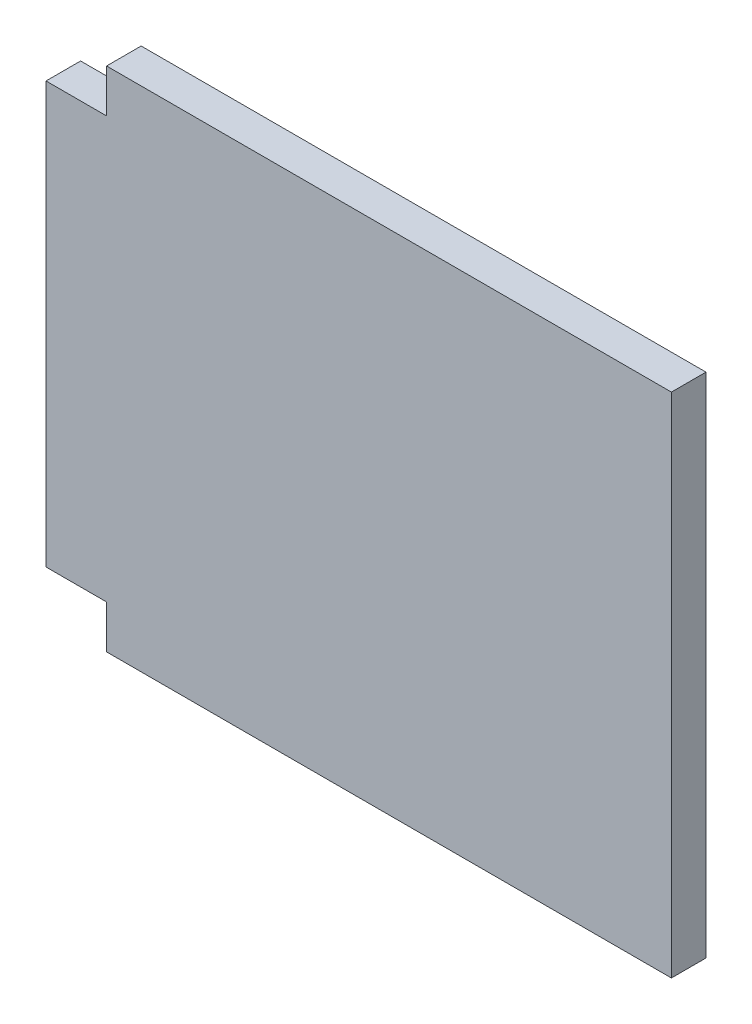
ISO-10303-21;
HEADER;
FILE_DESCRIPTION(('STEP AP214'),'2;1');
FILE_NAME('part.step','',(''),(''),'','','');
FILE_SCHEMA(('AUTOMOTIVE_DESIGN { 1 0 10303 214 1 1 1 1 }'));
ENDSEC;
DATA;
#1=APPLICATION_CONTEXT('core data for automotive mechanical design processes');
#2=APPLICATION_PROTOCOL_DEFINITION('international standard','automotive_design',2000,#1);
#3=PRODUCT_CONTEXT('',#1,'mechanical');
#4=PRODUCT('Part','Part','',(#3));
#5=PRODUCT_RELATED_PRODUCT_CATEGORY('part','',(#4));
#6=PRODUCT_DEFINITION_FORMATION('','',#4);
#7=PRODUCT_DEFINITION_CONTEXT('part definition',#1,'design');
#8=PRODUCT_DEFINITION('design','',#6,#7);
#9=PRODUCT_DEFINITION_SHAPE('','',#8);
#10=(LENGTH_UNIT() NAMED_UNIT(*) SI_UNIT(.MILLI.,.METRE.));
#11=(NAMED_UNIT(*) PLANE_ANGLE_UNIT() SI_UNIT($,.RADIAN.));
#12=(NAMED_UNIT(*) SI_UNIT($,.STERADIAN.) SOLID_ANGLE_UNIT());
#13=UNCERTAINTY_MEASURE_WITH_UNIT(LENGTH_MEASURE(1.E-05),#10,'distance_accuracy_value','');
#14=(GEOMETRIC_REPRESENTATION_CONTEXT(3) GLOBAL_UNCERTAINTY_ASSIGNED_CONTEXT((#13)) GLOBAL_UNIT_ASSIGNED_CONTEXT((#10,
#11,#12)) REPRESENTATION_CONTEXT('',''));
#15=CARTESIAN_POINT('',(0.,0.,0.));
#16=DIRECTION('',(0.,0.,1.));
#17=DIRECTION('',(1.,0.,0.));
#18=AXIS2_PLACEMENT_3D('',#15,#16,#17);
#19=CARTESIAN_POINT('',(-15.3915602948095,0.,2.));
#20=DIRECTION('',(1.,0.,0.));
#21=DIRECTION('',(0.,0.,-1.));
#22=AXIS2_PLACEMENT_3D('',#19,#20,#21);
#23=PLANE('',#22);
#24=DIRECTION('',(0.,-1.,0.));
#25=VECTOR('',#24,1.);
#26=CARTESIAN_POINT('',(-15.3915602948095,0.,0.));
#27=LINE('',#26,#25);
#28=CARTESIAN_POINT('',(-15.3915602948095,32.25,0.));
#29=VERTEX_POINT('',#28);
#30=CARTESIAN_POINT('',(-15.3915602948095,2.91,0.));
#31=VERTEX_POINT('',#30);
#32=EDGE_CURVE('E130',#29,#31,#27,.T.);
#33=ORIENTED_EDGE('',*,*,#32,.F.);
#34=DIRECTION('',(0.,0.,-1.));
#35=VECTOR('',#34,1.);
#36=CARTESIAN_POINT('',(-15.3915602948095,32.25,2.));
#37=LINE('',#36,#35);
#38=CARTESIAN_POINT('',(-15.3915602948095,32.25,2.));
#39=VERTEX_POINT('',#38);
#40=EDGE_CURVE('E11',#39,#29,#37,.T.);
#41=ORIENTED_EDGE('',*,*,#40,.F.);
#42=DIRECTION('',(0.,-1.,0.));
#43=VECTOR('',#42,1.);
#44=CARTESIAN_POINT('',(-15.3915602948095,0.,2.));
#45=LINE('',#44,#43);
#46=CARTESIAN_POINT('',(-15.3915602948095,2.91,2.));
#47=VERTEX_POINT('',#46);
#48=EDGE_CURVE('E148',#39,#47,#45,.T.);
#49=ORIENTED_EDGE('',*,*,#48,.T.);
#50=DIRECTION('',(0.,0.,-1.));
#51=VECTOR('',#50,1.);
#52=CARTESIAN_POINT('',(-15.3915602948095,2.91,2.));
#53=LINE('',#52,#51);
#54=EDGE_CURVE('E85',#47,#31,#53,.T.);
#55=ORIENTED_EDGE('',*,*,#54,.T.);
#56=EDGE_LOOP('',(#33,#41,#49,#55));
#57=FACE_BOUND('',#56,.T.);
#58=ADVANCED_FACE('F35',(#57),#23,.T.);
#59=CARTESIAN_POINT('',(0.,32.25,2.));
#60=DIRECTION('',(0.,1.,0.));
#61=DIRECTION('',(-1.,0.,0.));
#62=AXIS2_PLACEMENT_3D('',#59,#60,#61);
#63=PLANE('',#62);
#64=DIRECTION('',(1.,0.,0.));
#65=VECTOR('',#64,1.);
#66=CARTESIAN_POINT('',(0.,32.25,0.));
#67=LINE('',#66,#65);
#68=CARTESIAN_POINT('',(-48.0515602948095,32.25,0.));
#69=VERTEX_POINT('',#68);
#70=EDGE_CURVE('E133',#69,#29,#67,.T.);
#71=ORIENTED_EDGE('',*,*,#70,.F.);
#72=DIRECTION('',(0.,0.,-1.));
#73=VECTOR('',#72,1.);
#74=CARTESIAN_POINT('',(-48.0515602948095,32.25,2.));
#75=LINE('',#74,#73);
#76=CARTESIAN_POINT('',(-48.0515602948095,32.25,2.));
#77=VERTEX_POINT('',#76);
#78=EDGE_CURVE('E43',#77,#69,#75,.T.);
#79=ORIENTED_EDGE('',*,*,#78,.F.);
#80=DIRECTION('',(1.,0.,0.));
#81=VECTOR('',#80,1.);
#82=CARTESIAN_POINT('',(0.,32.25,2.));
#83=LINE('',#82,#81);
#84=EDGE_CURVE('E168',#77,#39,#83,.T.);
#85=ORIENTED_EDGE('',*,*,#84,.T.);
#86=ORIENTED_EDGE('',*,*,#40,.T.);
#87=EDGE_LOOP('',(#71,#79,#85,#86));
#88=FACE_BOUND('',#87,.T.);
#89=ADVANCED_FACE('F167',(#88),#63,.T.);
#90=CARTESIAN_POINT('',(-48.0515602948095,0.,2.));
#91=DIRECTION('',(1.,0.,0.));
#92=DIRECTION('',(0.,0.,-1.));
#93=AXIS2_PLACEMENT_3D('',#90,#91,#92);
#94=PLANE('',#93);
#95=DIRECTION('',(0.,-1.,0.));
#96=VECTOR('',#95,1.);
#97=CARTESIAN_POINT('',(-48.0515602948095,0.,0.));
#98=LINE('',#97,#96);
#99=CARTESIAN_POINT('',(-48.0515602948095,29.75,0.));
#100=VERTEX_POINT('',#99);
#101=EDGE_CURVE('E136',#69,#100,#98,.T.);
#102=ORIENTED_EDGE('',*,*,#101,.T.);
#103=DIRECTION('',(0.,0.,-1.));
#104=VECTOR('',#103,1.);
#105=CARTESIAN_POINT('',(-48.0515602948095,29.75,2.));
#106=LINE('',#105,#104);
#107=CARTESIAN_POINT('',(-48.0515602948095,29.75,2.));
#108=VERTEX_POINT('',#107);
#109=EDGE_CURVE('E154',#108,#100,#106,.T.);
#110=ORIENTED_EDGE('',*,*,#109,.F.);
#111=DIRECTION('',(0.,-1.,0.));
#112=VECTOR('',#111,1.);
#113=CARTESIAN_POINT('',(-48.0515602948095,0.,2.));
#114=LINE('',#113,#112);
#115=EDGE_CURVE('E118',#77,#108,#114,.T.);
#116=ORIENTED_EDGE('',*,*,#115,.F.);
#117=ORIENTED_EDGE('',*,*,#78,.T.);
#118=EDGE_LOOP('',(#102,#110,#116,#117));
#119=FACE_BOUND('',#118,.T.);
#120=ADVANCED_FACE('F158',(#119),#94,.F.);
#121=CARTESIAN_POINT('',(0.,29.75,2.));
#122=DIRECTION('',(0.,1.,0.));
#123=DIRECTION('',(0.,0.,1.));
#124=AXIS2_PLACEMENT_3D('',#121,#122,#123);
#125=PLANE('',#124);
#126=DIRECTION('',(1.,0.,0.));
#127=VECTOR('',#126,1.);
#128=CARTESIAN_POINT('',(0.,29.75,0.));
#129=LINE('',#128,#127);
#130=CARTESIAN_POINT('',(-51.5515602948095,29.75,0.));
#131=VERTEX_POINT('',#130);
#132=EDGE_CURVE('E139',#131,#100,#129,.T.);
#133=ORIENTED_EDGE('',*,*,#132,.F.);
#134=DIRECTION('',(0.,0.,-1.));
#135=VECTOR('',#134,1.);
#136=CARTESIAN_POINT('',(-51.5515602948095,29.75,2.));
#137=LINE('',#136,#135);
#138=CARTESIAN_POINT('',(-51.5515602948095,29.75,2.));
#139=VERTEX_POINT('',#138);
#140=EDGE_CURVE('E152',#139,#131,#137,.T.);
#141=ORIENTED_EDGE('',*,*,#140,.F.);
#142=DIRECTION('',(1.,0.,0.));
#143=VECTOR('',#142,1.);
#144=CARTESIAN_POINT('',(0.,29.75,2.));
#145=LINE('',#144,#143);
#146=EDGE_CURVE('E125',#139,#108,#145,.T.);
#147=ORIENTED_EDGE('',*,*,#146,.T.);
#148=ORIENTED_EDGE('',*,*,#109,.T.);
#149=EDGE_LOOP('',(#133,#141,#147,#148));
#150=FACE_BOUND('',#149,.T.);
#151=ADVANCED_FACE('F176',(#150),#125,.T.);
#152=CARTESIAN_POINT('',(-51.5515602948095,0.,2.));
#153=DIRECTION('',(-1.,0.,0.));
#154=DIRECTION('',(0.,0.,1.));
#155=AXIS2_PLACEMENT_3D('',#152,#153,#154);
#156=PLANE('',#155);
#157=DIRECTION('',(0.,1.,0.));
#158=VECTOR('',#157,1.);
#159=CARTESIAN_POINT('',(-51.5515602948095,0.,0.));
#160=LINE('',#159,#158);
#161=CARTESIAN_POINT('',(-51.5515602948095,5.41000000000001,0.));
#162=VERTEX_POINT('',#161);
#163=EDGE_CURVE('E142',#162,#131,#160,.T.);
#164=ORIENTED_EDGE('',*,*,#163,.F.);
#165=DIRECTION('',(0.,0.,-1.));
#166=VECTOR('',#165,1.);
#167=CARTESIAN_POINT('',(-51.5515602948095,5.41000000000001,2.));
#168=LINE('',#167,#166);
#169=CARTESIAN_POINT('',(-51.5515602948095,5.41000000000001,2.));
#170=VERTEX_POINT('',#169);
#171=EDGE_CURVE('E112',#170,#162,#168,.T.);
#172=ORIENTED_EDGE('',*,*,#171,.F.);
#173=DIRECTION('',(0.,1.,0.));
#174=VECTOR('',#173,1.);
#175=CARTESIAN_POINT('',(-51.5515602948095,0.,2.));
#176=LINE('',#175,#174);
#177=EDGE_CURVE('E123',#170,#139,#176,.T.);
#178=ORIENTED_EDGE('',*,*,#177,.T.);
#179=ORIENTED_EDGE('',*,*,#140,.T.);
#180=EDGE_LOOP('',(#164,#172,#178,#179));
#181=FACE_BOUND('',#180,.T.);
#182=ADVANCED_FACE('F179',(#181),#156,.T.);
#183=CARTESIAN_POINT('',(0.,5.41000000000001,2.));
#184=DIRECTION('',(0.,-1.,0.));
#185=DIRECTION('',(0.,0.,-1.));
#186=AXIS2_PLACEMENT_3D('',#183,#184,#185);
#187=PLANE('',#186);
#188=DIRECTION('',(-1.,0.,0.));
#189=VECTOR('',#188,1.);
#190=CARTESIAN_POINT('',(0.,5.41000000000001,0.));
#191=LINE('',#190,#189);
#192=CARTESIAN_POINT('',(-48.0515602948095,5.41000000000001,0.));
#193=VERTEX_POINT('',#192);
#194=EDGE_CURVE('E111',#193,#162,#191,.T.);
#195=ORIENTED_EDGE('',*,*,#194,.F.);
#196=DIRECTION('',(0.,0.,-1.));
#197=VECTOR('',#196,1.);
#198=CARTESIAN_POINT('',(-48.0515602948095,5.41000000000001,2.));
#199=LINE('',#198,#197);
#200=CARTESIAN_POINT('',(-48.0515602948095,5.41000000000001,2.));
#201=VERTEX_POINT('',#200);
#202=EDGE_CURVE('E105',#201,#193,#199,.T.);
#203=ORIENTED_EDGE('',*,*,#202,.F.);
#204=DIRECTION('',(-1.,0.,0.));
#205=VECTOR('',#204,1.);
#206=CARTESIAN_POINT('',(0.,5.41000000000001,2.));
#207=LINE('',#206,#205);
#208=EDGE_CURVE('E109',#201,#170,#207,.T.);
#209=ORIENTED_EDGE('',*,*,#208,.T.);
#210=ORIENTED_EDGE('',*,*,#171,.T.);
#211=EDGE_LOOP('',(#195,#203,#209,#210));
#212=FACE_BOUND('',#211,.T.);
#213=ADVANCED_FACE('F107',(#212),#187,.T.);
#214=CARTESIAN_POINT('',(-48.0515602948095,2.91000000000001,0.));
#215=VERTEX_POINT('',#214);
#216=EDGE_CURVE('E78',#193,#215,#98,.T.);
#217=ORIENTED_EDGE('',*,*,#216,.T.);
#218=DIRECTION('',(0.,0.,-1.));
#219=VECTOR('',#218,1.);
#220=CARTESIAN_POINT('',(-48.0515602948095,2.91000000000001,2.));
#221=LINE('',#220,#219);
#222=CARTESIAN_POINT('',(-48.0515602948095,2.91000000000001,2.));
#223=VERTEX_POINT('',#222);
#224=EDGE_CURVE('E113',#223,#215,#221,.T.);
#225=ORIENTED_EDGE('',*,*,#224,.F.);
#226=EDGE_CURVE('E115',#201,#223,#114,.T.);
#227=ORIENTED_EDGE('',*,*,#226,.F.);
#228=ORIENTED_EDGE('',*,*,#202,.T.);
#229=EDGE_LOOP('',(#217,#225,#227,#228));
#230=FACE_BOUND('',#229,.T.);
#231=ADVANCED_FACE('F116',(#230),#94,.F.);
#232=CARTESIAN_POINT('',(0.,2.91,2.));
#233=DIRECTION('',(0.,1.,0.));
#234=DIRECTION('',(-1.,0.,0.));
#235=AXIS2_PLACEMENT_3D('',#232,#233,#234);
#236=PLANE('',#235);
#237=DIRECTION('',(1.,0.,0.));
#238=VECTOR('',#237,1.);
#239=CARTESIAN_POINT('',(0.,2.91,0.));
#240=LINE('',#239,#238);
#241=EDGE_CURVE('E146',#215,#31,#240,.T.);
#242=ORIENTED_EDGE('',*,*,#241,.T.);
#243=ORIENTED_EDGE('',*,*,#54,.F.);
#244=DIRECTION('',(1.,0.,0.));
#245=VECTOR('',#244,1.);
#246=CARTESIAN_POINT('',(0.,2.91,2.));
#247=LINE('',#246,#245);
#248=EDGE_CURVE('E51',#223,#47,#247,.T.);
#249=ORIENTED_EDGE('',*,*,#248,.F.);
#250=ORIENTED_EDGE('',*,*,#224,.T.);
#251=EDGE_LOOP('',(#242,#243,#249,#250));
#252=FACE_BOUND('',#251,.T.);
#253=ADVANCED_FACE('F171',(#252),#236,.F.);
#254=CARTESIAN_POINT('',(0.,0.,2.));
#255=DIRECTION('',(0.,0.,1.));
#256=DIRECTION('',(1.,0.,0.));
#257=AXIS2_PLACEMENT_3D('',#254,#255,#256);
#258=PLANE('',#257);
#259=ORIENTED_EDGE('',*,*,#48,.F.);
#260=ORIENTED_EDGE('',*,*,#84,.F.);
#261=ORIENTED_EDGE('',*,*,#115,.T.);
#262=ORIENTED_EDGE('',*,*,#146,.F.);
#263=ORIENTED_EDGE('',*,*,#177,.F.);
#264=ORIENTED_EDGE('',*,*,#208,.F.);
#265=ORIENTED_EDGE('',*,*,#226,.T.);
#266=ORIENTED_EDGE('',*,*,#248,.T.);
#267=EDGE_LOOP('',(#259,#260,#261,#262,#263,#264,#265,#266));
#268=FACE_BOUND('',#267,.T.);
#269=ADVANCED_FACE('F120',(#268),#258,.T.);
#270=CARTESIAN_POINT('',(0.,0.,0.));
#271=DIRECTION('',(0.,0.,1.));
#272=DIRECTION('',(1.,0.,0.));
#273=AXIS2_PLACEMENT_3D('',#270,#271,#272);
#274=PLANE('',#273);
#275=ORIENTED_EDGE('',*,*,#32,.T.);
#276=ORIENTED_EDGE('',*,*,#241,.F.);
#277=ORIENTED_EDGE('',*,*,#216,.F.);
#278=ORIENTED_EDGE('',*,*,#194,.T.);
#279=ORIENTED_EDGE('',*,*,#163,.T.);
#280=ORIENTED_EDGE('',*,*,#132,.T.);
#281=ORIENTED_EDGE('',*,*,#101,.F.);
#282=ORIENTED_EDGE('',*,*,#70,.T.);
#283=EDGE_LOOP('',(#275,#276,#277,#278,#279,#280,#281,#282));
#284=FACE_BOUND('',#283,.T.);
#285=ADVANCED_FACE('F165',(#284),#274,.F.);
#286=CLOSED_SHELL('',(#58,#89,#120,#151,#182,#213,#231,#253,#269,#285));
#287=MANIFOLD_SOLID_BREP('B2',#286);
#288=ADVANCED_BREP_SHAPE_REPRESENTATION('',(#18,#287),#14);
#289=SHAPE_DEFINITION_REPRESENTATION(#9,#288);
ENDSEC;
END-ISO-10303-21;
